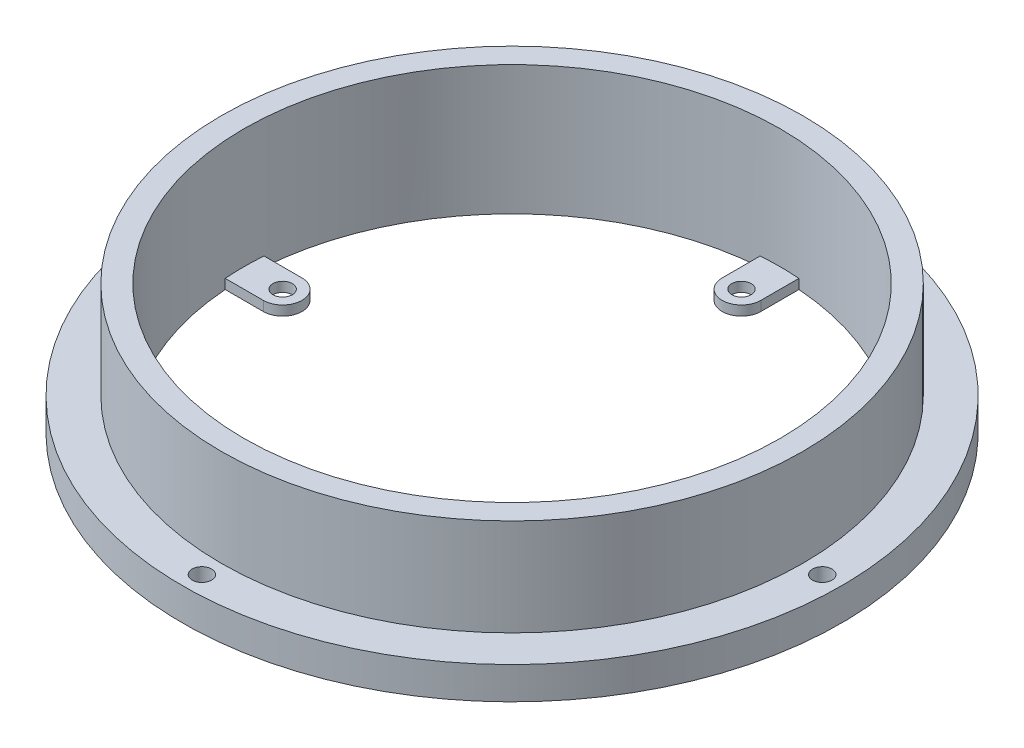
ISO-10303-21;
HEADER;
FILE_DESCRIPTION(('STEP AP214'),'2;1');
FILE_NAME('part.step','',(''),(''),'','','');
FILE_SCHEMA(('AUTOMOTIVE_DESIGN { 1 0 10303 214 1 1 1 1 }'));
ENDSEC;
DATA;
#1=APPLICATION_CONTEXT('core data for automotive mechanical design processes');
#2=APPLICATION_PROTOCOL_DEFINITION('international standard','automotive_design',2000,#1);
#3=PRODUCT_CONTEXT('',#1,'mechanical');
#4=PRODUCT('Part','Part','',(#3));
#5=PRODUCT_RELATED_PRODUCT_CATEGORY('part','',(#4));
#6=PRODUCT_DEFINITION_FORMATION('','',#4);
#7=PRODUCT_DEFINITION_CONTEXT('part definition',#1,'design');
#8=PRODUCT_DEFINITION('design','',#6,#7);
#9=PRODUCT_DEFINITION_SHAPE('','',#8);
#10=(LENGTH_UNIT() NAMED_UNIT(*) SI_UNIT(.MILLI.,.METRE.));
#11=(NAMED_UNIT(*) PLANE_ANGLE_UNIT() SI_UNIT($,.RADIAN.));
#12=(NAMED_UNIT(*) SI_UNIT($,.STERADIAN.) SOLID_ANGLE_UNIT());
#13=UNCERTAINTY_MEASURE_WITH_UNIT(LENGTH_MEASURE(1.E-05),#10,'distance_accuracy_value','');
#14=(GEOMETRIC_REPRESENTATION_CONTEXT(3) GLOBAL_UNCERTAINTY_ASSIGNED_CONTEXT((#13)) GLOBAL_UNIT_ASSIGNED_CONTEXT((#10,
#11,#12)) REPRESENTATION_CONTEXT('',''));
#15=CARTESIAN_POINT('',(0.,0.,0.));
#16=DIRECTION('',(0.,0.,1.));
#17=DIRECTION('',(1.,0.,0.));
#18=AXIS2_PLACEMENT_3D('',#15,#16,#17);
#19=CARTESIAN_POINT('',(0.,20.,0.));
#20=DIRECTION('',(0.,-1.,0.));
#21=DIRECTION('',(0.,0.,-1.));
#22=AXIS2_PLACEMENT_3D('',#19,#20,#21);
#23=CYLINDRICAL_SURFACE('',#22,45.);
#24=CARTESIAN_POINT('',(0.,20.,0.));
#25=DIRECTION('',(0.,1.,0.));
#26=DIRECTION('',(0.,0.,1.));
#27=AXIS2_PLACEMENT_3D('',#24,#25,#26);
#28=CIRCLE('',#27,45.);
#29=CARTESIAN_POINT('',(0.,20.,45.));
#30=VERTEX_POINT('',#29);
#31=EDGE_CURVE('E343',#30,#30,#28,.T.);
#32=ORIENTED_EDGE('',*,*,#31,.F.);
#33=EDGE_LOOP('',(#32));
#34=FACE_BOUND('',#33,.T.);
#35=CARTESIAN_POINT('',(0.,5.,0.));
#36=DIRECTION('',(0.,-1.,0.));
#37=DIRECTION('',(0.,0.,-1.));
#38=AXIS2_PLACEMENT_3D('',#35,#36,#37);
#39=CIRCLE('',#38,45.);
#40=CARTESIAN_POINT('',(0.,5.,-45.));
#41=VERTEX_POINT('',#40);
#42=EDGE_CURVE('E365',#41,#41,#39,.T.);
#43=ORIENTED_EDGE('',*,*,#42,.F.);
#44=EDGE_LOOP('',(#43));
#45=FACE_BOUND('',#44,.T.);
#46=ADVANCED_FACE('F45',(#34,#45),#23,.T.);
#47=CARTESIAN_POINT('',(0.,20.,0.));
#48=DIRECTION('',(0.,1.,0.));
#49=DIRECTION('',(0.,0.,1.));
#50=AXIS2_PLACEMENT_3D('',#47,#48,#49);
#51=PLANE('',#50);
#52=ORIENTED_EDGE('',*,*,#31,.T.);
#53=EDGE_LOOP('',(#52));
#54=FACE_BOUND('',#53,.T.);
#55=CARTESIAN_POINT('',(0.,20.,0.));
#56=DIRECTION('',(0.,1.,0.));
#57=DIRECTION('',(0.,0.,1.));
#58=AXIS2_PLACEMENT_3D('',#55,#56,#57);
#59=CIRCLE('',#58,41.5);
#60=CARTESIAN_POINT('',(0.,20.,41.5));
#61=VERTEX_POINT('',#60);
#62=EDGE_CURVE('E311',#61,#61,#59,.T.);
#63=ORIENTED_EDGE('',*,*,#62,.F.);
#64=EDGE_LOOP('',(#63));
#65=FACE_BOUND('',#64,.T.);
#66=ADVANCED_FACE('F441',(#54,#65),#51,.T.);
#67=CARTESIAN_POINT('',(0.,0.,0.));
#68=DIRECTION('',(0.,1.,0.));
#69=DIRECTION('',(0.,0.,1.));
#70=AXIS2_PLACEMENT_3D('',#67,#68,#69);
#71=PLANE('',#70);
#72=CARTESIAN_POINT('',(48.,0.,0.));
#73=DIRECTION('',(0.,-1.,0.));
#74=DIRECTION('',(0.,0.,-1.));
#75=AXIS2_PLACEMENT_3D('',#72,#73,#74);
#76=CIRCLE('',#75,1.5);
#77=CARTESIAN_POINT('',(48.,0.,-1.5));
#78=VERTEX_POINT('',#77);
#79=EDGE_CURVE('E321',#78,#78,#76,.T.);
#80=ORIENTED_EDGE('',*,*,#79,.F.);
#81=EDGE_LOOP('',(#80));
#82=FACE_BOUND('',#81,.T.);
#83=CARTESIAN_POINT('',(5.02773312793411E-13,0.,48.));
#84=DIRECTION('',(0.,-1.,0.));
#85=DIRECTION('',(0.,0.,-1.));
#86=AXIS2_PLACEMENT_3D('',#83,#84,#85);
#87=CIRCLE('',#86,1.50000000000001);
#88=CARTESIAN_POINT('',(5.02773312793411E-13,0.,46.5));
#89=VERTEX_POINT('',#88);
#90=EDGE_CURVE('E347',#89,#89,#87,.T.);
#91=ORIENTED_EDGE('',*,*,#90,.F.);
#92=EDGE_LOOP('',(#91));
#93=FACE_BOUND('',#92,.T.);
#94=CARTESIAN_POINT('',(-48.,0.,3.35182208528941E-13));
#95=DIRECTION('',(0.,-1.,0.));
#96=DIRECTION('',(0.,0.,-1.));
#97=AXIS2_PLACEMENT_3D('',#94,#95,#96);
#98=CIRCLE('',#97,1.5);
#99=CARTESIAN_POINT('',(-48.,0.,-1.49999999999967));
#100=VERTEX_POINT('',#99);
#101=EDGE_CURVE('E351',#100,#100,#98,.T.);
#102=ORIENTED_EDGE('',*,*,#101,.F.);
#103=EDGE_LOOP('',(#102));
#104=FACE_BOUND('',#103,.T.);
#105=CARTESIAN_POINT('',(-1.6759110426447E-13,0.,-48.));
#106=DIRECTION('',(0.,-1.,0.));
#107=DIRECTION('',(0.,0.,-1.));
#108=AXIS2_PLACEMENT_3D('',#105,#106,#107);
#109=CIRCLE('',#108,1.5);
#110=CARTESIAN_POINT('',(-1.6759110426447E-13,0.,-49.5));
#111=VERTEX_POINT('',#110);
#112=EDGE_CURVE('E355',#111,#111,#109,.T.);
#113=ORIENTED_EDGE('',*,*,#112,.F.);
#114=EDGE_LOOP('',(#113));
#115=FACE_BOUND('',#114,.T.);
#116=CARTESIAN_POINT('',(0.,0.,0.));
#117=DIRECTION('',(0.,-1.,0.));
#118=DIRECTION('',(0.,0.,-1.));
#119=AXIS2_PLACEMENT_3D('',#116,#117,#118);
#120=CIRCLE('',#119,51.);
#121=CARTESIAN_POINT('',(0.,0.,-51.));
#122=VERTEX_POINT('',#121);
#123=EDGE_CURVE('E327',#122,#122,#120,.T.);
#124=ORIENTED_EDGE('',*,*,#123,.T.);
#125=EDGE_LOOP('',(#124));
#126=FACE_BOUND('',#125,.T.);
#127=CARTESIAN_POINT('',(0.,0.,0.));
#128=DIRECTION('',(0.,1.,0.));
#129=DIRECTION('',(0.,0.,1.));
#130=AXIS2_PLACEMENT_3D('',#127,#128,#129);
#131=CIRCLE('',#130,41.5);
#132=CARTESIAN_POINT('',(-41.3914242325629,0.,-3.00000000000101));
#133=VERTEX_POINT('',#132);
#134=CARTESIAN_POINT('',(-2.999999999998,0.,-41.3914242325631));
#135=VERTEX_POINT('',#134);
#136=EDGE_CURVE('E163',#133,#135,#131,.F.);
#137=ORIENTED_EDGE('',*,*,#136,.F.);
#138=DIRECTION('',(1.,0.,0.));
#139=VECTOR('',#138,1.);
#140=CARTESIAN_POINT('',(-35.499999999999,0.,-3.00000000000101));
#141=LINE('',#140,#139);
#142=CARTESIAN_POINT('',(-35.499999999999,0.,-3.00000000000101));
#143=VERTEX_POINT('',#142);
#144=EDGE_CURVE('E155',#133,#143,#141,.T.);
#145=ORIENTED_EDGE('',*,*,#144,.T.);
#146=CARTESIAN_POINT('',(-35.499999999999,0.,-1.00679693671086E-12));
#147=DIRECTION('',(0.,-1.,0.));
#148=DIRECTION('',(0.,0.,-1.));
#149=AXIS2_PLACEMENT_3D('',#146,#147,#148);
#150=CIRCLE('',#149,3.);
#151=CARTESIAN_POINT('',(-35.499999999999,0.,2.99999999999899));
#152=VERTEX_POINT('',#151);
#153=EDGE_CURVE('E161',#143,#152,#150,.T.);
#154=ORIENTED_EDGE('',*,*,#153,.T.);
#155=DIRECTION('',(-1.,0.,0.));
#156=VECTOR('',#155,1.);
#157=CARTESIAN_POINT('',(-35.499999999999,0.,2.99999999999899));
#158=LINE('',#157,#156);
#159=CARTESIAN_POINT('',(-41.391424232563,0.,2.99999999999899));
#160=VERTEX_POINT('',#159);
#161=EDGE_CURVE('E166',#152,#160,#158,.T.);
#162=ORIENTED_EDGE('',*,*,#161,.T.);
#163=CARTESIAN_POINT('',(-3.,0.,41.391424232563));
#164=VERTEX_POINT('',#163);
#165=EDGE_CURVE('E318',#164,#160,#131,.F.);
#166=ORIENTED_EDGE('',*,*,#165,.F.);
#167=DIRECTION('',(0.,0.,-1.));
#168=VECTOR('',#167,1.);
#169=CARTESIAN_POINT('',(-3.,0.,35.5));
#170=LINE('',#169,#168);
#171=CARTESIAN_POINT('',(-3.,0.,35.5));
#172=VERTEX_POINT('',#171);
#173=EDGE_CURVE('E290',#164,#172,#170,.T.);
#174=ORIENTED_EDGE('',*,*,#173,.T.);
#175=CARTESIAN_POINT('',(0.,0.,35.5));
#176=DIRECTION('',(0.,-1.,0.));
#177=DIRECTION('',(0.,0.,-1.));
#178=AXIS2_PLACEMENT_3D('',#175,#176,#177);
#179=CIRCLE('',#178,3.);
#180=CARTESIAN_POINT('',(3.,0.,35.5));
#181=VERTEX_POINT('',#180);
#182=EDGE_CURVE('E281',#172,#181,#179,.T.);
#183=ORIENTED_EDGE('',*,*,#182,.T.);
#184=DIRECTION('',(0.,0.,1.));
#185=VECTOR('',#184,1.);
#186=CARTESIAN_POINT('',(3.,0.,35.5));
#187=LINE('',#186,#185);
#188=CARTESIAN_POINT('',(3.,0.,41.391424232563));
#189=VERTEX_POINT('',#188);
#190=EDGE_CURVE('E301',#181,#189,#187,.T.);
#191=ORIENTED_EDGE('',*,*,#190,.T.);
#192=CARTESIAN_POINT('',(41.3914242325629,0.,3.000000000001));
#193=VERTEX_POINT('',#192);
#194=EDGE_CURVE('E317',#193,#189,#131,.F.);
#195=ORIENTED_EDGE('',*,*,#194,.F.);
#196=DIRECTION('',(-1.,0.,0.));
#197=VECTOR('',#196,1.);
#198=CARTESIAN_POINT('',(35.500000000001,0.,3.000000000001));
#199=LINE('',#198,#197);
#200=CARTESIAN_POINT('',(35.500000000001,0.,3.000000000001));
#201=VERTEX_POINT('',#200);
#202=EDGE_CURVE('E247',#193,#201,#199,.T.);
#203=ORIENTED_EDGE('',*,*,#202,.T.);
#204=CARTESIAN_POINT('',(35.500000000001,0.,1.00244944057388E-12));
#205=DIRECTION('',(0.,-1.,0.));
#206=DIRECTION('',(0.,0.,-1.));
#207=AXIS2_PLACEMENT_3D('',#204,#205,#206);
#208=CIRCLE('',#207,3.);
#209=CARTESIAN_POINT('',(35.500000000001,0.,-2.999999999999));
#210=VERTEX_POINT('',#209);
#211=EDGE_CURVE('E255',#201,#210,#208,.T.);
#212=ORIENTED_EDGE('',*,*,#211,.T.);
#213=DIRECTION('',(1.,0.,0.));
#214=VECTOR('',#213,1.);
#215=CARTESIAN_POINT('',(35.500000000001,0.,-2.999999999999));
#216=LINE('',#215,#214);
#217=CARTESIAN_POINT('',(41.391424232563,0.,-2.999999999999));
#218=VERTEX_POINT('',#217);
#219=EDGE_CURVE('E250',#210,#218,#216,.T.);
#220=ORIENTED_EDGE('',*,*,#219,.T.);
#221=CARTESIAN_POINT('',(3.00000000000201,0.,-41.3914242325628));
#222=VERTEX_POINT('',#221);
#223=EDGE_CURVE('E406',#222,#218,#131,.F.);
#224=ORIENTED_EDGE('',*,*,#223,.F.);
#225=DIRECTION('',(0.,0.,1.));
#226=VECTOR('',#225,1.);
#227=CARTESIAN_POINT('',(3.00000000000201,0.,-35.5));
#228=LINE('',#227,#226);
#229=CARTESIAN_POINT('',(3.00000000000201,0.,-35.5));
#230=VERTEX_POINT('',#229);
#231=EDGE_CURVE('E211',#222,#230,#228,.T.);
#232=ORIENTED_EDGE('',*,*,#231,.T.);
#233=CARTESIAN_POINT('',(2.00563366922725E-12,0.,-35.5));
#234=DIRECTION('',(0.,-1.,0.));
#235=DIRECTION('',(0.,0.,-1.));
#236=AXIS2_PLACEMENT_3D('',#233,#234,#235);
#237=CIRCLE('',#236,3.);
#238=CARTESIAN_POINT('',(-2.999999999998,0.,-35.5));
#239=VERTEX_POINT('',#238);
#240=EDGE_CURVE('E218',#230,#239,#237,.T.);
#241=ORIENTED_EDGE('',*,*,#240,.T.);
#242=DIRECTION('',(0.,0.,-1.));
#243=VECTOR('',#242,1.);
#244=CARTESIAN_POINT('',(-2.999999999998,0.,-35.5));
#245=LINE('',#244,#243);
#246=EDGE_CURVE('E214',#239,#135,#245,.T.);
#247=ORIENTED_EDGE('',*,*,#246,.T.);
#248=EDGE_LOOP('',(#137,#145,#154,#162,#166,#174,#183,#191,#195,#203,#212,#220,#224,#232,#241,#247));
#249=FACE_BOUND('',#248,.T.);
#250=CARTESIAN_POINT('',(0.,0.,35.5));
#251=DIRECTION('',(0.,-1.,0.));
#252=DIRECTION('',(0.,0.,-1.));
#253=AXIS2_PLACEMENT_3D('',#250,#251,#252);
#254=CIRCLE('',#253,1.5);
#255=CARTESIAN_POINT('',(0.,0.,34.));
#256=VERTEX_POINT('',#255);
#257=EDGE_CURVE('E273',#256,#256,#254,.T.);
#258=ORIENTED_EDGE('',*,*,#257,.F.);
#259=EDGE_LOOP('',(#258));
#260=FACE_BOUND('',#259,.T.);
#261=CARTESIAN_POINT('',(35.500000000001,0.,1.00244944057388E-12));
#262=DIRECTION('',(0.,-1.,0.));
#263=DIRECTION('',(0.,0.,-1.));
#264=AXIS2_PLACEMENT_3D('',#261,#262,#263);
#265=CIRCLE('',#264,1.50000000000078);
#266=CARTESIAN_POINT('',(35.500000000001,0.,-1.49999999999978));
#267=VERTEX_POINT('',#266);
#268=EDGE_CURVE('E269',#267,#267,#265,.T.);
#269=ORIENTED_EDGE('',*,*,#268,.F.);
#270=EDGE_LOOP('',(#269));
#271=FACE_BOUND('',#270,.T.);
#272=CARTESIAN_POINT('',(2.00563366922725E-12,0.,-35.5));
#273=DIRECTION('',(0.,-1.,0.));
#274=DIRECTION('',(0.,0.,-1.));
#275=AXIS2_PLACEMENT_3D('',#272,#273,#274);
#276=CIRCLE('',#275,1.50000000000216);
#277=CARTESIAN_POINT('',(2.00563366922725E-12,0.,-37.0000000000022));
#278=VERTEX_POINT('',#277);
#279=EDGE_CURVE('E232',#278,#278,#276,.T.);
#280=ORIENTED_EDGE('',*,*,#279,.F.);
#281=EDGE_LOOP('',(#280));
#282=FACE_BOUND('',#281,.T.);
#283=CARTESIAN_POINT('',(-35.499999999999,0.,-1.00679693671086E-12));
#284=DIRECTION('',(0.,-1.,0.));
#285=DIRECTION('',(0.,0.,-1.));
#286=AXIS2_PLACEMENT_3D('',#283,#284,#285);
#287=CIRCLE('',#286,1.50000000000161);
#288=CARTESIAN_POINT('',(-35.499999999999,0.,-1.50000000000262));
#289=VERTEX_POINT('',#288);
#290=EDGE_CURVE('E188',#289,#289,#287,.T.);
#291=ORIENTED_EDGE('',*,*,#290,.F.);
#292=EDGE_LOOP('',(#291));
#293=FACE_BOUND('',#292,.T.);
#294=ADVANCED_FACE('F157',(#82,#93,#104,#115,#126,#249,#260,#271,#282,#293),#71,.F.);
#295=CARTESIAN_POINT('',(-1.6759110426447E-13,5.,-48.));
#296=DIRECTION('',(0.,-1.,0.));
#297=DIRECTION('',(0.,0.,-1.));
#298=AXIS2_PLACEMENT_3D('',#295,#296,#297);
#299=CYLINDRICAL_SURFACE('',#298,1.5);
#300=CARTESIAN_POINT('',(-1.6759110426447E-13,5.,-48.));
#301=DIRECTION('',(0.,-1.,0.));
#302=DIRECTION('',(0.,0.,-1.));
#303=AXIS2_PLACEMENT_3D('',#300,#301,#302);
#304=CIRCLE('',#303,1.5);
#305=CARTESIAN_POINT('',(-1.6759110426447E-13,5.,-49.5));
#306=VERTEX_POINT('',#305);
#307=EDGE_CURVE('E335',#306,#306,#304,.T.);
#308=ORIENTED_EDGE('',*,*,#307,.F.);
#309=EDGE_LOOP('',(#308));
#310=FACE_BOUND('',#309,.T.);
#311=ORIENTED_EDGE('',*,*,#112,.T.);
#312=EDGE_LOOP('',(#311));
#313=FACE_BOUND('',#312,.T.);
#314=ADVANCED_FACE('F466',(#310,#313),#299,.F.);
#315=CARTESIAN_POINT('',(-48.,5.,3.35182208528941E-13));
#316=DIRECTION('',(0.,-1.,0.));
#317=DIRECTION('',(0.,0.,-1.));
#318=AXIS2_PLACEMENT_3D('',#315,#316,#317);
#319=CYLINDRICAL_SURFACE('',#318,1.5);
#320=CARTESIAN_POINT('',(-48.,5.,3.35182208528941E-13));
#321=DIRECTION('',(0.,-1.,0.));
#322=DIRECTION('',(0.,0.,-1.));
#323=AXIS2_PLACEMENT_3D('',#320,#321,#322);
#324=CIRCLE('',#323,1.5);
#325=CARTESIAN_POINT('',(-48.,5.,-1.49999999999967));
#326=VERTEX_POINT('',#325);
#327=EDGE_CURVE('E331',#326,#326,#324,.T.);
#328=ORIENTED_EDGE('',*,*,#327,.F.);
#329=EDGE_LOOP('',(#328));
#330=FACE_BOUND('',#329,.T.);
#331=ORIENTED_EDGE('',*,*,#101,.T.);
#332=EDGE_LOOP('',(#331));
#333=FACE_BOUND('',#332,.T.);
#334=ADVANCED_FACE('F471',(#330,#333),#319,.F.);
#335=CARTESIAN_POINT('',(5.02773312793411E-13,5.,48.));
#336=DIRECTION('',(0.,-1.,0.));
#337=DIRECTION('',(0.,0.,-1.));
#338=AXIS2_PLACEMENT_3D('',#335,#336,#337);
#339=CYLINDRICAL_SURFACE('',#338,1.50000000000001);
#340=CARTESIAN_POINT('',(5.02773312793411E-13,5.,48.));
#341=DIRECTION('',(0.,-1.,0.));
#342=DIRECTION('',(0.,0.,-1.));
#343=AXIS2_PLACEMENT_3D('',#340,#341,#342);
#344=CIRCLE('',#343,1.50000000000001);
#345=CARTESIAN_POINT('',(5.02773312793411E-13,5.,46.5));
#346=VERTEX_POINT('',#345);
#347=EDGE_CURVE('E326',#346,#346,#344,.T.);
#348=ORIENTED_EDGE('',*,*,#347,.F.);
#349=EDGE_LOOP('',(#348));
#350=FACE_BOUND('',#349,.T.);
#351=ORIENTED_EDGE('',*,*,#90,.T.);
#352=EDGE_LOOP('',(#351));
#353=FACE_BOUND('',#352,.T.);
#354=ADVANCED_FACE('F479',(#350,#353),#339,.F.);
#355=CARTESIAN_POINT('',(48.,5.,0.));
#356=DIRECTION('',(0.,-1.,0.));
#357=DIRECTION('',(0.,0.,-1.));
#358=AXIS2_PLACEMENT_3D('',#355,#356,#357);
#359=CYLINDRICAL_SURFACE('',#358,1.5);
#360=CARTESIAN_POINT('',(48.,5.,0.));
#361=DIRECTION('',(0.,-1.,0.));
#362=DIRECTION('',(0.,0.,-1.));
#363=AXIS2_PLACEMENT_3D('',#360,#361,#362);
#364=CIRCLE('',#363,1.5);
#365=CARTESIAN_POINT('',(48.,5.,-1.5));
#366=VERTEX_POINT('',#365);
#367=EDGE_CURVE('E322',#366,#366,#364,.T.);
#368=ORIENTED_EDGE('',*,*,#367,.F.);
#369=EDGE_LOOP('',(#368));
#370=FACE_BOUND('',#369,.T.);
#371=ORIENTED_EDGE('',*,*,#79,.T.);
#372=EDGE_LOOP('',(#371));
#373=FACE_BOUND('',#372,.T.);
#374=ADVANCED_FACE('F462',(#370,#373),#359,.F.);
#375=CARTESIAN_POINT('',(0.,5.,0.));
#376=DIRECTION('',(0.,-1.,0.));
#377=DIRECTION('',(0.,0.,-1.));
#378=AXIS2_PLACEMENT_3D('',#375,#376,#377);
#379=CYLINDRICAL_SURFACE('',#378,51.);
#380=CARTESIAN_POINT('',(0.,5.,0.));
#381=DIRECTION('',(0.,-1.,0.));
#382=DIRECTION('',(0.,0.,-1.));
#383=AXIS2_PLACEMENT_3D('',#380,#381,#382);
#384=CIRCLE('',#383,51.);
#385=CARTESIAN_POINT('',(0.,5.,-51.));
#386=VERTEX_POINT('',#385);
#387=EDGE_CURVE('E339',#386,#386,#384,.T.);
#388=ORIENTED_EDGE('',*,*,#387,.T.);
#389=EDGE_LOOP('',(#388));
#390=FACE_BOUND('',#389,.T.);
#391=ORIENTED_EDGE('',*,*,#123,.F.);
#392=EDGE_LOOP('',(#391));
#393=FACE_BOUND('',#392,.T.);
#394=ADVANCED_FACE('F455',(#390,#393),#379,.T.);
#395=CARTESIAN_POINT('',(0.,5.,0.));
#396=DIRECTION('',(0.,-1.,0.));
#397=DIRECTION('',(0.,0.,-1.));
#398=AXIS2_PLACEMENT_3D('',#395,#396,#397);
#399=PLANE('',#398);
#400=ORIENTED_EDGE('',*,*,#367,.T.);
#401=EDGE_LOOP('',(#400));
#402=FACE_BOUND('',#401,.T.);
#403=ORIENTED_EDGE('',*,*,#347,.T.);
#404=EDGE_LOOP('',(#403));
#405=FACE_BOUND('',#404,.T.);
#406=ORIENTED_EDGE('',*,*,#327,.T.);
#407=EDGE_LOOP('',(#406));
#408=FACE_BOUND('',#407,.T.);
#409=ORIENTED_EDGE('',*,*,#307,.T.);
#410=EDGE_LOOP('',(#409));
#411=FACE_BOUND('',#410,.T.);
#412=ORIENTED_EDGE('',*,*,#42,.T.);
#413=EDGE_LOOP('',(#412));
#414=FACE_BOUND('',#413,.T.);
#415=ORIENTED_EDGE('',*,*,#387,.F.);
#416=EDGE_LOOP('',(#415));
#417=FACE_BOUND('',#416,.T.);
#418=ADVANCED_FACE('F437',(#402,#405,#408,#411,#414,#417),#399,.F.);
#419=CARTESIAN_POINT('',(0.,-118.79393923934,0.));
#420=DIRECTION('',(0.,1.,0.));
#421=DIRECTION('',(0.,0.,1.));
#422=AXIS2_PLACEMENT_3D('',#419,#420,#421);
#423=CYLINDRICAL_SURFACE('',#422,41.5);
#424=CARTESIAN_POINT('',(0.,1.5,0.));
#425=DIRECTION('',(0.,-1.,0.));
#426=DIRECTION('',(0.,0.,-1.));
#427=AXIS2_PLACEMENT_3D('',#424,#425,#426);
#428=CIRCLE('',#427,41.5);
#429=CARTESIAN_POINT('',(-41.3914242325629,1.5,-3.00000000000101));
#430=VERTEX_POINT('',#429);
#431=CARTESIAN_POINT('',(-41.391424232563,1.5,2.99999999999899));
#432=VERTEX_POINT('',#431);
#433=EDGE_CURVE('E62',#430,#432,#428,.F.);
#434=ORIENTED_EDGE('',*,*,#433,.F.);
#435=DIRECTION('',(0.,1.,0.));
#436=VECTOR('',#435,1.);
#437=CARTESIAN_POINT('',(-41.3914242325629,-118.79393923934,-3.00000000000101));
#438=LINE('',#437,#436);
#439=EDGE_CURVE('E11',#430,#133,#438,.F.);
#440=ORIENTED_EDGE('',*,*,#439,.T.);
#441=ORIENTED_EDGE('',*,*,#136,.T.);
#442=DIRECTION('',(0.,1.,0.));
#443=VECTOR('',#442,1.);
#444=CARTESIAN_POINT('',(-2.999999999998,-118.79393923934,-41.3914242325631));
#445=LINE('',#444,#443);
#446=CARTESIAN_POINT('',(-2.99999999999799,1.5,-41.3914242325631));
#447=VERTEX_POINT('',#446);
#448=EDGE_CURVE('E395',#135,#447,#445,.T.);
#449=ORIENTED_EDGE('',*,*,#448,.T.);
#450=CARTESIAN_POINT('',(0.,1.5,0.));
#451=DIRECTION('',(0.,-1.,0.));
#452=DIRECTION('',(0.,0.,-1.));
#453=AXIS2_PLACEMENT_3D('',#450,#451,#452);
#454=CIRCLE('',#453,41.5);
#455=CARTESIAN_POINT('',(3.00000000000201,1.5,-41.3914242325628));
#456=VERTEX_POINT('',#455);
#457=EDGE_CURVE('E391',#456,#447,#454,.F.);
#458=ORIENTED_EDGE('',*,*,#457,.F.);
#459=DIRECTION('',(0.,1.,0.));
#460=VECTOR('',#459,1.);
#461=CARTESIAN_POINT('',(3.00000000000201,-118.79393923934,-41.3914242325628));
#462=LINE('',#461,#460);
#463=EDGE_CURVE('E398',#456,#222,#462,.F.);
#464=ORIENTED_EDGE('',*,*,#463,.T.);
#465=ORIENTED_EDGE('',*,*,#223,.T.);
#466=DIRECTION('',(0.,1.,0.));
#467=VECTOR('',#466,1.);
#468=CARTESIAN_POINT('',(41.391424232563,-118.79393923934,-2.999999999999));
#469=LINE('',#468,#467);
#470=CARTESIAN_POINT('',(41.391424232563,1.5,-2.999999999999));
#471=VERTEX_POINT('',#470);
#472=EDGE_CURVE('E384',#218,#471,#469,.T.);
#473=ORIENTED_EDGE('',*,*,#472,.T.);
#474=CARTESIAN_POINT('',(0.,1.5,0.));
#475=DIRECTION('',(0.,-1.,0.));
#476=DIRECTION('',(0.,0.,-1.));
#477=AXIS2_PLACEMENT_3D('',#474,#475,#476);
#478=CIRCLE('',#477,41.5);
#479=CARTESIAN_POINT('',(41.3914242325629,1.5,3.000000000001));
#480=VERTEX_POINT('',#479);
#481=EDGE_CURVE('E380',#480,#471,#478,.F.);
#482=ORIENTED_EDGE('',*,*,#481,.F.);
#483=DIRECTION('',(0.,1.,0.));
#484=VECTOR('',#483,1.);
#485=CARTESIAN_POINT('',(41.3914242325629,-118.79393923934,3.000000000001));
#486=LINE('',#485,#484);
#487=EDGE_CURVE('E387',#480,#193,#486,.F.);
#488=ORIENTED_EDGE('',*,*,#487,.T.);
#489=ORIENTED_EDGE('',*,*,#194,.T.);
#490=DIRECTION('',(0.,1.,0.));
#491=VECTOR('',#490,1.);
#492=CARTESIAN_POINT('',(3.,-118.79393923934,41.391424232563));
#493=LINE('',#492,#491);
#494=CARTESIAN_POINT('',(3.,1.5,41.391424232563));
#495=VERTEX_POINT('',#494);
#496=EDGE_CURVE('E373',#189,#495,#493,.T.);
#497=ORIENTED_EDGE('',*,*,#496,.T.);
#498=CARTESIAN_POINT('',(0.,1.5,0.));
#499=DIRECTION('',(0.,-1.,0.));
#500=DIRECTION('',(0.,0.,-1.));
#501=AXIS2_PLACEMENT_3D('',#498,#499,#500);
#502=CIRCLE('',#501,41.5);
#503=CARTESIAN_POINT('',(-3.,1.5,41.391424232563));
#504=VERTEX_POINT('',#503);
#505=EDGE_CURVE('E369',#504,#495,#502,.F.);
#506=ORIENTED_EDGE('',*,*,#505,.F.);
#507=DIRECTION('',(0.,1.,0.));
#508=VECTOR('',#507,1.);
#509=CARTESIAN_POINT('',(-3.,-118.79393923934,41.391424232563));
#510=LINE('',#509,#508);
#511=EDGE_CURVE('E376',#504,#164,#510,.F.);
#512=ORIENTED_EDGE('',*,*,#511,.T.);
#513=ORIENTED_EDGE('',*,*,#165,.T.);
#514=DIRECTION('',(0.,1.,0.));
#515=VECTOR('',#514,1.);
#516=CARTESIAN_POINT('',(-41.391424232563,-118.79393923934,2.99999999999899));
#517=LINE('',#516,#515);
#518=EDGE_CURVE('E53',#160,#432,#517,.T.);
#519=ORIENTED_EDGE('',*,*,#518,.T.);
#520=EDGE_LOOP('',(#434,#440,#441,#449,#458,#464,#465,#473,#482,#488,#489,#497,#506,#512,#513,#519));
#521=FACE_BOUND('',#520,.T.);
#522=ORIENTED_EDGE('',*,*,#62,.T.);
#523=EDGE_LOOP('',(#522));
#524=FACE_BOUND('',#523,.T.);
#525=ADVANCED_FACE('F409',(#521,#524),#423,.F.);
#526=CARTESIAN_POINT('',(-3.,1.5,35.5));
#527=DIRECTION('',(-1.,0.,0.));
#528=DIRECTION('',(0.,0.,1.));
#529=AXIS2_PLACEMENT_3D('',#526,#527,#528);
#530=PLANE('',#529);
#531=ORIENTED_EDGE('',*,*,#511,.F.);
#532=DIRECTION('',(0.,0.,-1.));
#533=VECTOR('',#532,1.);
#534=CARTESIAN_POINT('',(-3.,1.5,35.5));
#535=LINE('',#534,#533);
#536=CARTESIAN_POINT('',(-3.,1.5,35.5));
#537=VERTEX_POINT('',#536);
#538=EDGE_CURVE('E294',#504,#537,#535,.T.);
#539=ORIENTED_EDGE('',*,*,#538,.T.);
#540=DIRECTION('',(0.,-1.,0.));
#541=VECTOR('',#540,1.);
#542=CARTESIAN_POINT('',(-3.,1.5,35.5));
#543=LINE('',#542,#541);
#544=EDGE_CURVE('E307',#537,#172,#543,.T.);
#545=ORIENTED_EDGE('',*,*,#544,.T.);
#546=ORIENTED_EDGE('',*,*,#173,.F.);
#547=EDGE_LOOP('',(#531,#539,#545,#546));
#548=FACE_BOUND('',#547,.T.);
#549=ADVANCED_FACE('F428',(#548),#530,.T.);
#550=CARTESIAN_POINT('',(3.,1.5,35.5));
#551=DIRECTION('',(1.,0.,0.));
#552=DIRECTION('',(0.,0.,-1.));
#553=AXIS2_PLACEMENT_3D('',#550,#551,#552);
#554=PLANE('',#553);
#555=ORIENTED_EDGE('',*,*,#496,.F.);
#556=ORIENTED_EDGE('',*,*,#190,.F.);
#557=DIRECTION('',(0.,-1.,0.));
#558=VECTOR('',#557,1.);
#559=CARTESIAN_POINT('',(3.,1.5,35.5));
#560=LINE('',#559,#558);
#561=CARTESIAN_POINT('',(3.,1.5,35.5));
#562=VERTEX_POINT('',#561);
#563=EDGE_CURVE('E297',#562,#181,#560,.T.);
#564=ORIENTED_EDGE('',*,*,#563,.F.);
#565=DIRECTION('',(0.,0.,1.));
#566=VECTOR('',#565,1.);
#567=CARTESIAN_POINT('',(3.,1.5,35.5));
#568=LINE('',#567,#566);
#569=EDGE_CURVE('E289',#562,#495,#568,.T.);
#570=ORIENTED_EDGE('',*,*,#569,.T.);
#571=EDGE_LOOP('',(#555,#556,#564,#570));
#572=FACE_BOUND('',#571,.T.);
#573=ADVANCED_FACE('F415',(#572),#554,.T.);
#574=CARTESIAN_POINT('',(0.,1.5,35.5));
#575=DIRECTION('',(0.,-1.,0.));
#576=DIRECTION('',(0.,0.,-1.));
#577=AXIS2_PLACEMENT_3D('',#574,#575,#576);
#578=PLANE('',#577);
#579=CARTESIAN_POINT('',(0.,1.5,35.5));
#580=DIRECTION('',(0.,-1.,0.));
#581=DIRECTION('',(0.,0.,-1.));
#582=AXIS2_PLACEMENT_3D('',#579,#580,#581);
#583=CIRCLE('',#582,1.5);
#584=CARTESIAN_POINT('',(0.,1.5,34.));
#585=VERTEX_POINT('',#584);
#586=EDGE_CURVE('E277',#585,#585,#583,.T.);
#587=ORIENTED_EDGE('',*,*,#586,.T.);
#588=EDGE_LOOP('',(#587));
#589=FACE_BOUND('',#588,.T.);
#590=ORIENTED_EDGE('',*,*,#538,.F.);
#591=ORIENTED_EDGE('',*,*,#505,.T.);
#592=ORIENTED_EDGE('',*,*,#569,.F.);
#593=CARTESIAN_POINT('',(0.,1.5,35.5));
#594=DIRECTION('',(0.,-1.,0.));
#595=DIRECTION('',(0.,0.,-1.));
#596=AXIS2_PLACEMENT_3D('',#593,#594,#595);
#597=CIRCLE('',#596,3.);
#598=EDGE_CURVE('E285',#537,#562,#597,.T.);
#599=ORIENTED_EDGE('',*,*,#598,.F.);
#600=EDGE_LOOP('',(#590,#591,#592,#599));
#601=FACE_BOUND('',#600,.T.);
#602=ADVANCED_FACE('F425',(#589,#601),#578,.F.);
#603=CARTESIAN_POINT('',(0.,1.5,35.5));
#604=DIRECTION('',(0.,-1.,0.));
#605=DIRECTION('',(0.,0.,-1.));
#606=AXIS2_PLACEMENT_3D('',#603,#604,#605);
#607=CYLINDRICAL_SURFACE('',#606,3.);
#608=ORIENTED_EDGE('',*,*,#182,.F.);
#609=ORIENTED_EDGE('',*,*,#544,.F.);
#610=ORIENTED_EDGE('',*,*,#598,.T.);
#611=ORIENTED_EDGE('',*,*,#563,.T.);
#612=EDGE_LOOP('',(#608,#609,#610,#611));
#613=FACE_BOUND('',#612,.T.);
#614=ADVANCED_FACE('F421',(#613),#607,.T.);
#615=CARTESIAN_POINT('',(0.,1.5,35.5));
#616=DIRECTION('',(0.,-1.,0.));
#617=DIRECTION('',(0.,0.,-1.));
#618=AXIS2_PLACEMENT_3D('',#615,#616,#617);
#619=CYLINDRICAL_SURFACE('',#618,1.5);
#620=ORIENTED_EDGE('',*,*,#586,.F.);
#621=EDGE_LOOP('',(#620));
#622=FACE_BOUND('',#621,.T.);
#623=ORIENTED_EDGE('',*,*,#257,.T.);
#624=EDGE_LOOP('',(#623));
#625=FACE_BOUND('',#624,.T.);
#626=ADVANCED_FACE('F488',(#622,#625),#619,.F.);
#627=CARTESIAN_POINT('',(35.500000000001,1.5,3.000000000001));
#628=DIRECTION('',(0.,0.,1.));
#629=DIRECTION('',(1.,0.,0.));
#630=AXIS2_PLACEMENT_3D('',#627,#628,#629);
#631=PLANE('',#630);
#632=ORIENTED_EDGE('',*,*,#487,.F.);
#633=DIRECTION('',(-1.,0.,0.));
#634=VECTOR('',#633,1.);
#635=CARTESIAN_POINT('',(35.500000000001,1.5,3.000000000001));
#636=LINE('',#635,#634);
#637=CARTESIAN_POINT('',(35.500000000001,1.5,3.000000000001));
#638=VERTEX_POINT('',#637);
#639=EDGE_CURVE('E243',#480,#638,#636,.T.);
#640=ORIENTED_EDGE('',*,*,#639,.T.);
#641=DIRECTION('',(0.,-1.,0.));
#642=VECTOR('',#641,1.);
#643=CARTESIAN_POINT('',(35.500000000001,1.5,3.000000000001));
#644=LINE('',#643,#642);
#645=EDGE_CURVE('E236',#638,#201,#644,.T.);
#646=ORIENTED_EDGE('',*,*,#645,.T.);
#647=ORIENTED_EDGE('',*,*,#202,.F.);
#648=EDGE_LOOP('',(#632,#640,#646,#647));
#649=FACE_BOUND('',#648,.T.);
#650=ADVANCED_FACE('F493',(#649),#631,.T.);
#651=CARTESIAN_POINT('',(35.500000000001,1.5,-2.999999999999));
#652=DIRECTION('',(0.,0.,-1.));
#653=DIRECTION('',(-1.,0.,0.));
#654=AXIS2_PLACEMENT_3D('',#651,#652,#653);
#655=PLANE('',#654);
#656=ORIENTED_EDGE('',*,*,#472,.F.);
#657=ORIENTED_EDGE('',*,*,#219,.F.);
#658=DIRECTION('',(0.,-1.,0.));
#659=VECTOR('',#658,1.);
#660=CARTESIAN_POINT('',(35.500000000001,1.5,-2.999999999999));
#661=LINE('',#660,#659);
#662=CARTESIAN_POINT('',(35.500000000001,1.5,-2.999999999999));
#663=VERTEX_POINT('',#662);
#664=EDGE_CURVE('E240',#663,#210,#661,.T.);
#665=ORIENTED_EDGE('',*,*,#664,.F.);
#666=DIRECTION('',(1.,0.,0.));
#667=VECTOR('',#666,1.);
#668=CARTESIAN_POINT('',(35.500000000001,1.5,-2.999999999999));
#669=LINE('',#668,#667);
#670=EDGE_CURVE('E262',#663,#471,#669,.T.);
#671=ORIENTED_EDGE('',*,*,#670,.T.);
#672=EDGE_LOOP('',(#656,#657,#665,#671));
#673=FACE_BOUND('',#672,.T.);
#674=ADVANCED_FACE('F509',(#673),#655,.T.);
#675=CARTESIAN_POINT('',(35.500000000001,1.5,1.00244944057388E-12));
#676=DIRECTION('',(0.,-1.,0.));
#677=DIRECTION('',(0.,0.,-1.));
#678=AXIS2_PLACEMENT_3D('',#675,#676,#677);
#679=PLANE('',#678);
#680=CARTESIAN_POINT('',(35.500000000001,1.5,1.00244944057388E-12));
#681=DIRECTION('',(0.,-1.,0.));
#682=DIRECTION('',(0.,0.,-1.));
#683=AXIS2_PLACEMENT_3D('',#680,#681,#682);
#684=CIRCLE('',#683,1.50000000000078);
#685=CARTESIAN_POINT('',(35.500000000001,1.5,-1.49999999999978));
#686=VERTEX_POINT('',#685);
#687=EDGE_CURVE('E259',#686,#686,#684,.T.);
#688=ORIENTED_EDGE('',*,*,#687,.T.);
#689=EDGE_LOOP('',(#688));
#690=FACE_BOUND('',#689,.T.);
#691=ORIENTED_EDGE('',*,*,#639,.F.);
#692=ORIENTED_EDGE('',*,*,#481,.T.);
#693=ORIENTED_EDGE('',*,*,#670,.F.);
#694=CARTESIAN_POINT('',(35.500000000001,1.5,1.00244944057388E-12));
#695=DIRECTION('',(0.,-1.,0.));
#696=DIRECTION('',(0.,0.,-1.));
#697=AXIS2_PLACEMENT_3D('',#694,#695,#696);
#698=CIRCLE('',#697,3.);
#699=EDGE_CURVE('E251',#638,#663,#698,.T.);
#700=ORIENTED_EDGE('',*,*,#699,.F.);
#701=EDGE_LOOP('',(#691,#692,#693,#700));
#702=FACE_BOUND('',#701,.T.);
#703=ADVANCED_FACE('F506',(#690,#702),#679,.F.);
#704=CARTESIAN_POINT('',(35.500000000001,1.5,1.00244944057388E-12));
#705=DIRECTION('',(0.,-1.,0.));
#706=DIRECTION('',(0.,0.,-1.));
#707=AXIS2_PLACEMENT_3D('',#704,#705,#706);
#708=CYLINDRICAL_SURFACE('',#707,3.);
#709=ORIENTED_EDGE('',*,*,#211,.F.);
#710=ORIENTED_EDGE('',*,*,#645,.F.);
#711=ORIENTED_EDGE('',*,*,#699,.T.);
#712=ORIENTED_EDGE('',*,*,#664,.T.);
#713=EDGE_LOOP('',(#709,#710,#711,#712));
#714=FACE_BOUND('',#713,.T.);
#715=ADVANCED_FACE('F504',(#714),#708,.T.);
#716=CARTESIAN_POINT('',(35.500000000001,1.5,1.00244944057388E-12));
#717=DIRECTION('',(0.,-1.,0.));
#718=DIRECTION('',(0.,0.,-1.));
#719=AXIS2_PLACEMENT_3D('',#716,#717,#718);
#720=CYLINDRICAL_SURFACE('',#719,1.50000000000078);
#721=ORIENTED_EDGE('',*,*,#687,.F.);
#722=EDGE_LOOP('',(#721));
#723=FACE_BOUND('',#722,.T.);
#724=ORIENTED_EDGE('',*,*,#268,.T.);
#725=EDGE_LOOP('',(#724));
#726=FACE_BOUND('',#725,.T.);
#727=ADVANCED_FACE('F500',(#723,#726),#720,.F.);
#728=CARTESIAN_POINT('',(3.00000000000201,1.5,-35.5));
#729=DIRECTION('',(1.,0.,0.));
#730=DIRECTION('',(0.,0.,-1.));
#731=AXIS2_PLACEMENT_3D('',#728,#729,#730);
#732=PLANE('',#731);
#733=ORIENTED_EDGE('',*,*,#463,.F.);
#734=DIRECTION('',(0.,0.,1.));
#735=VECTOR('',#734,1.);
#736=CARTESIAN_POINT('',(3.00000000000201,1.5,-35.5));
#737=LINE('',#736,#735);
#738=CARTESIAN_POINT('',(3.00000000000201,1.5,-35.5));
#739=VERTEX_POINT('',#738);
#740=EDGE_CURVE('E207',#456,#739,#737,.T.);
#741=ORIENTED_EDGE('',*,*,#740,.T.);
#742=DIRECTION('',(0.,-1.,0.));
#743=VECTOR('',#742,1.);
#744=CARTESIAN_POINT('',(3.00000000000201,1.5,-35.5));
#745=LINE('',#744,#743);
#746=EDGE_CURVE('E202',#739,#230,#745,.T.);
#747=ORIENTED_EDGE('',*,*,#746,.T.);
#748=ORIENTED_EDGE('',*,*,#231,.F.);
#749=EDGE_LOOP('',(#733,#741,#747,#748));
#750=FACE_BOUND('',#749,.T.);
#751=ADVANCED_FACE('F503',(#750),#732,.T.);
#752=CARTESIAN_POINT('',(-2.999999999998,1.5,-35.5));
#753=DIRECTION('',(-1.,0.,0.));
#754=DIRECTION('',(0.,0.,1.));
#755=AXIS2_PLACEMENT_3D('',#752,#753,#754);
#756=PLANE('',#755);
#757=ORIENTED_EDGE('',*,*,#448,.F.);
#758=ORIENTED_EDGE('',*,*,#246,.F.);
#759=DIRECTION('',(0.,-1.,0.));
#760=VECTOR('',#759,1.);
#761=CARTESIAN_POINT('',(-2.999999999998,1.5,-35.5));
#762=LINE('',#761,#760);
#763=CARTESIAN_POINT('',(-2.999999999998,1.5,-35.5));
#764=VERTEX_POINT('',#763);
#765=EDGE_CURVE('E204',#764,#239,#762,.T.);
#766=ORIENTED_EDGE('',*,*,#765,.F.);
#767=DIRECTION('',(0.,0.,-1.));
#768=VECTOR('',#767,1.);
#769=CARTESIAN_POINT('',(-2.999999999998,1.5,-35.5));
#770=LINE('',#769,#768);
#771=EDGE_CURVE('E225',#764,#447,#770,.T.);
#772=ORIENTED_EDGE('',*,*,#771,.T.);
#773=EDGE_LOOP('',(#757,#758,#766,#772));
#774=FACE_BOUND('',#773,.T.);
#775=ADVANCED_FACE('F528',(#774),#756,.T.);
#776=CARTESIAN_POINT('',(2.00563366922725E-12,1.5,-35.5));
#777=DIRECTION('',(0.,-1.,0.));
#778=DIRECTION('',(0.,0.,-1.));
#779=AXIS2_PLACEMENT_3D('',#776,#777,#778);
#780=PLANE('',#779);
#781=CARTESIAN_POINT('',(2.00563366922725E-12,1.5,-35.5));
#782=DIRECTION('',(0.,-1.,0.));
#783=DIRECTION('',(0.,0.,-1.));
#784=AXIS2_PLACEMENT_3D('',#781,#782,#783);
#785=CIRCLE('',#784,1.50000000000216);
#786=CARTESIAN_POINT('',(2.00563366922725E-12,1.5,-37.0000000000022));
#787=VERTEX_POINT('',#786);
#788=EDGE_CURVE('E222',#787,#787,#785,.T.);
#789=ORIENTED_EDGE('',*,*,#788,.T.);
#790=EDGE_LOOP('',(#789));
#791=FACE_BOUND('',#790,.T.);
#792=ORIENTED_EDGE('',*,*,#740,.F.);
#793=ORIENTED_EDGE('',*,*,#457,.T.);
#794=ORIENTED_EDGE('',*,*,#771,.F.);
#795=CARTESIAN_POINT('',(2.00563366922725E-12,1.5,-35.5));
#796=DIRECTION('',(0.,-1.,0.));
#797=DIRECTION('',(0.,0.,-1.));
#798=AXIS2_PLACEMENT_3D('',#795,#796,#797);
#799=CIRCLE('',#798,3.);
#800=EDGE_CURVE('E215',#739,#764,#799,.T.);
#801=ORIENTED_EDGE('',*,*,#800,.F.);
#802=EDGE_LOOP('',(#792,#793,#794,#801));
#803=FACE_BOUND('',#802,.T.);
#804=ADVANCED_FACE('F525',(#791,#803),#780,.F.);
#805=CARTESIAN_POINT('',(2.00563366922725E-12,1.5,-35.5));
#806=DIRECTION('',(0.,-1.,0.));
#807=DIRECTION('',(0.,0.,-1.));
#808=AXIS2_PLACEMENT_3D('',#805,#806,#807);
#809=CYLINDRICAL_SURFACE('',#808,3.);
#810=ORIENTED_EDGE('',*,*,#240,.F.);
#811=ORIENTED_EDGE('',*,*,#746,.F.);
#812=ORIENTED_EDGE('',*,*,#800,.T.);
#813=ORIENTED_EDGE('',*,*,#765,.T.);
#814=EDGE_LOOP('',(#810,#811,#812,#813));
#815=FACE_BOUND('',#814,.T.);
#816=ADVANCED_FACE('F523',(#815),#809,.T.);
#817=CARTESIAN_POINT('',(2.00563366922725E-12,1.5,-35.5));
#818=DIRECTION('',(0.,-1.,0.));
#819=DIRECTION('',(0.,0.,-1.));
#820=AXIS2_PLACEMENT_3D('',#817,#818,#819);
#821=CYLINDRICAL_SURFACE('',#820,1.50000000000216);
#822=ORIENTED_EDGE('',*,*,#788,.F.);
#823=EDGE_LOOP('',(#822));
#824=FACE_BOUND('',#823,.T.);
#825=ORIENTED_EDGE('',*,*,#279,.T.);
#826=EDGE_LOOP('',(#825));
#827=FACE_BOUND('',#826,.T.);
#828=ADVANCED_FACE('F520',(#824,#827),#821,.F.);
#829=CARTESIAN_POINT('',(-35.499999999999,1.5,-3.00000000000101));
#830=DIRECTION('',(0.,0.,-1.));
#831=DIRECTION('',(-1.,0.,0.));
#832=AXIS2_PLACEMENT_3D('',#829,#830,#831);
#833=PLANE('',#832);
#834=ORIENTED_EDGE('',*,*,#439,.F.);
#835=DIRECTION('',(1.,0.,0.));
#836=VECTOR('',#835,1.);
#837=CARTESIAN_POINT('',(-35.499999999999,1.5,-3.00000000000101));
#838=LINE('',#837,#836);
#839=CARTESIAN_POINT('',(-35.499999999999,1.5,-3.00000000000101));
#840=VERTEX_POINT('',#839);
#841=EDGE_CURVE('E173',#430,#840,#838,.T.);
#842=ORIENTED_EDGE('',*,*,#841,.T.);
#843=DIRECTION('',(0.,-1.,0.));
#844=VECTOR('',#843,1.);
#845=CARTESIAN_POINT('',(-35.499999999999,1.5,-3.00000000000101));
#846=LINE('',#845,#844);
#847=EDGE_CURVE('E170',#840,#143,#846,.T.);
#848=ORIENTED_EDGE('',*,*,#847,.T.);
#849=ORIENTED_EDGE('',*,*,#144,.F.);
#850=EDGE_LOOP('',(#834,#842,#848,#849));
#851=FACE_BOUND('',#850,.T.);
#852=ADVANCED_FACE('F171',(#851),#833,.T.);
#853=CARTESIAN_POINT('',(-35.499999999999,1.5,2.99999999999899));
#854=DIRECTION('',(0.,0.,1.));
#855=DIRECTION('',(1.,0.,0.));
#856=AXIS2_PLACEMENT_3D('',#853,#854,#855);
#857=PLANE('',#856);
#858=ORIENTED_EDGE('',*,*,#518,.F.);
#859=ORIENTED_EDGE('',*,*,#161,.F.);
#860=DIRECTION('',(0.,-1.,0.));
#861=VECTOR('',#860,1.);
#862=CARTESIAN_POINT('',(-35.499999999999,1.5,2.99999999999899));
#863=LINE('',#862,#861);
#864=CARTESIAN_POINT('',(-35.499999999999,1.5,2.99999999999899));
#865=VERTEX_POINT('',#864);
#866=EDGE_CURVE('E178',#865,#152,#863,.T.);
#867=ORIENTED_EDGE('',*,*,#866,.F.);
#868=DIRECTION('',(-1.,0.,0.));
#869=VECTOR('',#868,1.);
#870=CARTESIAN_POINT('',(-35.499999999999,1.5,2.99999999999899));
#871=LINE('',#870,#869);
#872=EDGE_CURVE('E194',#865,#432,#871,.T.);
#873=ORIENTED_EDGE('',*,*,#872,.T.);
#874=EDGE_LOOP('',(#858,#859,#867,#873));
#875=FACE_BOUND('',#874,.T.);
#876=ADVANCED_FACE('F546',(#875),#857,.T.);
#877=CARTESIAN_POINT('',(-35.499999999999,1.5,-1.00679693671086E-12));
#878=DIRECTION('',(0.,-1.,0.));
#879=DIRECTION('',(0.,0.,-1.));
#880=AXIS2_PLACEMENT_3D('',#877,#878,#879);
#881=PLANE('',#880);
#882=CARTESIAN_POINT('',(-35.499999999999,1.5,-1.00679693671086E-12));
#883=DIRECTION('',(0.,-1.,0.));
#884=DIRECTION('',(0.,0.,-1.));
#885=AXIS2_PLACEMENT_3D('',#882,#883,#884);
#886=CIRCLE('',#885,1.50000000000161);
#887=CARTESIAN_POINT('',(-35.499999999999,1.5,-1.50000000000262));
#888=VERTEX_POINT('',#887);
#889=EDGE_CURVE('E183',#888,#888,#886,.T.);
#890=ORIENTED_EDGE('',*,*,#889,.T.);
#891=EDGE_LOOP('',(#890));
#892=FACE_BOUND('',#891,.T.);
#893=ORIENTED_EDGE('',*,*,#841,.F.);
#894=ORIENTED_EDGE('',*,*,#433,.T.);
#895=ORIENTED_EDGE('',*,*,#872,.F.);
#896=CARTESIAN_POINT('',(-35.499999999999,1.5,-1.00679693671086E-12));
#897=DIRECTION('',(0.,-1.,0.));
#898=DIRECTION('',(0.,0.,-1.));
#899=AXIS2_PLACEMENT_3D('',#896,#897,#898);
#900=CIRCLE('',#899,3.);
#901=EDGE_CURVE('E167',#840,#865,#900,.T.);
#902=ORIENTED_EDGE('',*,*,#901,.F.);
#903=EDGE_LOOP('',(#893,#894,#895,#902));
#904=FACE_BOUND('',#903,.T.);
#905=ADVANCED_FACE('F543',(#892,#904),#881,.F.);
#906=CARTESIAN_POINT('',(-35.499999999999,1.5,-1.00679693671086E-12));
#907=DIRECTION('',(0.,-1.,0.));
#908=DIRECTION('',(0.,0.,-1.));
#909=AXIS2_PLACEMENT_3D('',#906,#907,#908);
#910=CYLINDRICAL_SURFACE('',#909,3.);
#911=ORIENTED_EDGE('',*,*,#153,.F.);
#912=ORIENTED_EDGE('',*,*,#847,.F.);
#913=ORIENTED_EDGE('',*,*,#901,.T.);
#914=ORIENTED_EDGE('',*,*,#866,.T.);
#915=EDGE_LOOP('',(#911,#912,#913,#914));
#916=FACE_BOUND('',#915,.T.);
#917=ADVANCED_FACE('F180',(#916),#910,.T.);
#918=CARTESIAN_POINT('',(-35.499999999999,1.5,-1.00679693671086E-12));
#919=DIRECTION('',(0.,-1.,0.));
#920=DIRECTION('',(0.,0.,-1.));
#921=AXIS2_PLACEMENT_3D('',#918,#919,#920);
#922=CYLINDRICAL_SURFACE('',#921,1.50000000000161);
#923=ORIENTED_EDGE('',*,*,#889,.F.);
#924=EDGE_LOOP('',(#923));
#925=FACE_BOUND('',#924,.T.);
#926=ORIENTED_EDGE('',*,*,#290,.T.);
#927=EDGE_LOOP('',(#926));
#928=FACE_BOUND('',#927,.T.);
#929=ADVANCED_FACE('F539',(#925,#928),#922,.F.);
#930=CLOSED_SHELL('',(#46,#66,#294,#314,#334,#354,#374,#394,#418,#525,#549,#573,#602,#614,#626,
#650,#674,#703,#715,#727,#751,#775,#804,#816,#828,#852,#876,#905,#917,#929));
#931=MANIFOLD_SOLID_BREP('B2',#930);
#932=ADVANCED_BREP_SHAPE_REPRESENTATION('',(#18,#931),#14);
#933=SHAPE_DEFINITION_REPRESENTATION(#9,#932);
ENDSEC;
END-ISO-10303-21;
